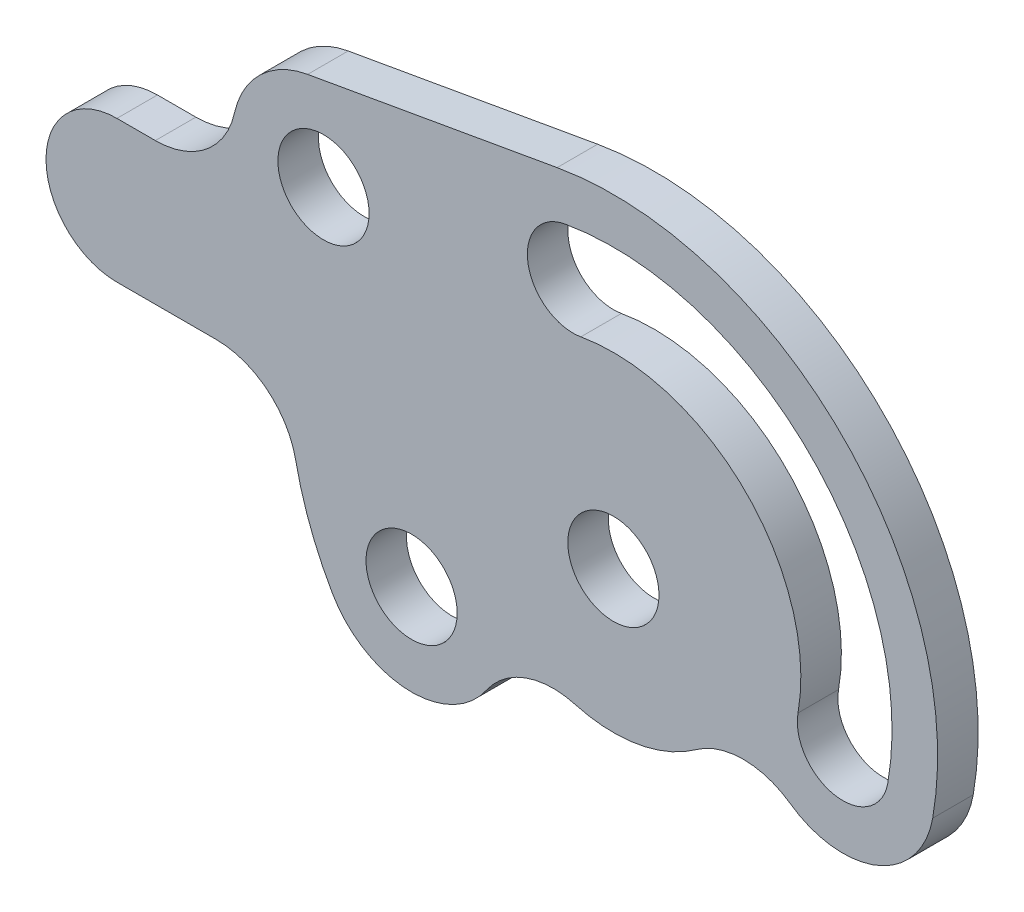
ISO-10303-21;
HEADER;
FILE_DESCRIPTION(('STEP AP214'),'2;1');
FILE_NAME('part.step','',(''),(''),'','','');
FILE_SCHEMA(('AUTOMOTIVE_DESIGN { 1 0 10303 214 1 1 1 1 }'));
ENDSEC;
DATA;
#1=APPLICATION_CONTEXT('core data for automotive mechanical design processes');
#2=APPLICATION_PROTOCOL_DEFINITION('international standard','automotive_design',2000,#1);
#3=PRODUCT_CONTEXT('',#1,'mechanical');
#4=PRODUCT('Part','Part','',(#3));
#5=PRODUCT_RELATED_PRODUCT_CATEGORY('part','',(#4));
#6=PRODUCT_DEFINITION_FORMATION('','',#4);
#7=PRODUCT_DEFINITION_CONTEXT('part definition',#1,'design');
#8=PRODUCT_DEFINITION('design','',#6,#7);
#9=PRODUCT_DEFINITION_SHAPE('','',#8);
#10=(LENGTH_UNIT() NAMED_UNIT(*) SI_UNIT(.MILLI.,.METRE.));
#11=(NAMED_UNIT(*) PLANE_ANGLE_UNIT() SI_UNIT($,.RADIAN.));
#12=(NAMED_UNIT(*) SI_UNIT($,.STERADIAN.) SOLID_ANGLE_UNIT());
#13=UNCERTAINTY_MEASURE_WITH_UNIT(LENGTH_MEASURE(1.E-05),#10,'distance_accuracy_value','');
#14=(GEOMETRIC_REPRESENTATION_CONTEXT(3) GLOBAL_UNCERTAINTY_ASSIGNED_CONTEXT((#13)) GLOBAL_UNIT_ASSIGNED_CONTEXT((#10,
#11,#12)) REPRESENTATION_CONTEXT('',''));
#15=CARTESIAN_POINT('',(0.,0.,0.));
#16=DIRECTION('',(0.,0.,1.));
#17=DIRECTION('',(1.,0.,0.));
#18=AXIS2_PLACEMENT_3D('',#15,#16,#17);
#19=CARTESIAN_POINT('',(8.98944827046456,-1.58508227176595,1.5875));
#20=DIRECTION('',(0.,0.,-1.));
#21=DIRECTION('',(-1.,0.,0.));
#22=AXIS2_PLACEMENT_3D('',#19,#20,#21);
#23=CYLINDRICAL_SURFACE('',#22,1.7859375);
#24=CARTESIAN_POINT('',(8.98944827046456,-1.58508227176595,0.));
#25=DIRECTION('',(0.,0.,1.));
#26=DIRECTION('',(1.,0.,0.));
#27=AXIS2_PLACEMENT_3D('',#24,#25,#26);
#28=CIRCLE('',#27,1.7859375);
#29=CARTESIAN_POINT('',(7.23064317406932,-1.27495747946392,0.));
#30=VERTEX_POINT('',#29);
#31=CARTESIAN_POINT('',(10.7482533668598,-1.89520706406799,0.));
#32=VERTEX_POINT('',#31);
#33=EDGE_CURVE('E288',#30,#32,#28,.T.);
#34=ORIENTED_EDGE('',*,*,#33,.F.);
#35=DIRECTION('',(0.,0.,-1.));
#36=VECTOR('',#35,1.);
#37=CARTESIAN_POINT('',(7.23064317406932,-1.27495747946392,1.5875));
#38=LINE('',#37,#36);
#39=CARTESIAN_POINT('',(7.23064317406932,-1.27495747946392,1.5875));
#40=VERTEX_POINT('',#39);
#41=EDGE_CURVE('E324',#40,#30,#38,.T.);
#42=ORIENTED_EDGE('',*,*,#41,.F.);
#43=CARTESIAN_POINT('',(8.98944827046456,-1.58508227176595,1.5875));
#44=DIRECTION('',(0.,0.,1.));
#45=DIRECTION('',(1.,0.,0.));
#46=AXIS2_PLACEMENT_3D('',#43,#44,#45);
#47=CIRCLE('',#46,1.7859375);
#48=CARTESIAN_POINT('',(10.7482533668598,-1.89520706406799,1.5875));
#49=VERTEX_POINT('',#48);
#50=EDGE_CURVE('E226',#40,#49,#47,.T.);
#51=ORIENTED_EDGE('',*,*,#50,.T.);
#52=DIRECTION('',(0.,0.,-1.));
#53=VECTOR('',#52,1.);
#54=CARTESIAN_POINT('',(10.7482533668598,-1.89520706406799,1.5875));
#55=LINE('',#54,#53);
#56=EDGE_CURVE('E193',#49,#32,#55,.T.);
#57=ORIENTED_EDGE('',*,*,#56,.T.);
#58=EDGE_LOOP('',(#34,#42,#51,#57));
#59=FACE_BOUND('',#58,.T.);
#60=ADVANCED_FACE('F41',(#59),#23,.F.);
#61=CARTESIAN_POINT('',(0.,0.,1.5875));
#62=DIRECTION('',(0.,0.,-1.));
#63=DIRECTION('',(-1.,0.,0.));
#64=AXIS2_PLACEMENT_3D('',#61,#62,#63);
#65=CYLINDRICAL_SURFACE('',#64,7.3421875);
#66=CARTESIAN_POINT('',(0.,0.,0.));
#67=DIRECTION('',(0.,0.,1.));
#68=DIRECTION('',(1.,0.,0.));
#69=AXIS2_PLACEMENT_3D('',#66,#67,#68);
#70=CIRCLE('',#69,7.3421875);
#71=CARTESIAN_POINT('',(-1.27495747946392,7.23064317406932,0.));
#72=VERTEX_POINT('',#71);
#73=EDGE_CURVE('E292',#30,#72,#70,.T.);
#74=ORIENTED_EDGE('',*,*,#73,.T.);
#75=DIRECTION('',(0.,0.,-1.));
#76=VECTOR('',#75,1.);
#77=CARTESIAN_POINT('',(-1.27495747946392,7.23064317406932,1.5875));
#78=LINE('',#77,#76);
#79=CARTESIAN_POINT('',(-1.27495747946392,7.23064317406932,1.5875));
#80=VERTEX_POINT('',#79);
#81=EDGE_CURVE('E321',#80,#72,#78,.T.);
#82=ORIENTED_EDGE('',*,*,#81,.F.);
#83=CARTESIAN_POINT('',(0.,0.,1.5875));
#84=DIRECTION('',(0.,0.,1.));
#85=DIRECTION('',(1.,0.,0.));
#86=AXIS2_PLACEMENT_3D('',#83,#84,#85);
#87=CIRCLE('',#86,7.3421875);
#88=EDGE_CURVE('E230',#40,#80,#87,.T.);
#89=ORIENTED_EDGE('',*,*,#88,.F.);
#90=ORIENTED_EDGE('',*,*,#41,.T.);
#91=EDGE_LOOP('',(#74,#82,#89,#90));
#92=FACE_BOUND('',#91,.T.);
#93=ADVANCED_FACE('F437',(#92),#65,.T.);
#94=CARTESIAN_POINT('',(-1.58508227176596,8.98944827046456,1.5875));
#95=DIRECTION('',(0.,0.,-1.));
#96=DIRECTION('',(-1.,0.,0.));
#97=AXIS2_PLACEMENT_3D('',#94,#95,#96);
#98=CYLINDRICAL_SURFACE('',#97,1.7859375);
#99=CARTESIAN_POINT('',(-1.58508227176596,8.98944827046456,0.));
#100=DIRECTION('',(0.,0.,1.));
#101=DIRECTION('',(1.,0.,0.));
#102=AXIS2_PLACEMENT_3D('',#99,#100,#101);
#103=CIRCLE('',#102,1.7859375);
#104=CARTESIAN_POINT('',(-1.89520706406799,10.7482533668598,0.));
#105=VERTEX_POINT('',#104);
#106=EDGE_CURVE('E296',#105,#72,#103,.T.);
#107=ORIENTED_EDGE('',*,*,#106,.F.);
#108=DIRECTION('',(0.,0.,-1.));
#109=VECTOR('',#108,1.);
#110=CARTESIAN_POINT('',(-1.89520706406799,10.7482533668598,1.5875));
#111=LINE('',#110,#109);
#112=CARTESIAN_POINT('',(-1.89520706406799,10.7482533668598,1.5875));
#113=VERTEX_POINT('',#112);
#114=EDGE_CURVE('E318',#113,#105,#111,.T.);
#115=ORIENTED_EDGE('',*,*,#114,.F.);
#116=CARTESIAN_POINT('',(-1.58508227176596,8.98944827046456,1.5875));
#117=DIRECTION('',(0.,0.,1.));
#118=DIRECTION('',(1.,0.,0.));
#119=AXIS2_PLACEMENT_3D('',#116,#117,#118);
#120=CIRCLE('',#119,1.7859375);
#121=EDGE_CURVE('E233',#113,#80,#120,.T.);
#122=ORIENTED_EDGE('',*,*,#121,.T.);
#123=ORIENTED_EDGE('',*,*,#81,.T.);
#124=EDGE_LOOP('',(#107,#115,#122,#123));
#125=FACE_BOUND('',#124,.T.);
#126=ADVANCED_FACE('F443',(#125),#98,.F.);
#127=CARTESIAN_POINT('',(0.,0.,1.5875));
#128=DIRECTION('',(0.,0.,-1.));
#129=DIRECTION('',(-1.,0.,0.));
#130=AXIS2_PLACEMENT_3D('',#127,#128,#129);
#131=CYLINDRICAL_SURFACE('',#130,5.55625);
#132=CARTESIAN_POINT('',(0.,0.,0.));
#133=DIRECTION('',(0.,0.,1.));
#134=DIRECTION('',(1.,0.,0.));
#135=AXIS2_PLACEMENT_3D('',#132,#133,#134);
#136=CIRCLE('',#135,5.55625);
#137=CARTESIAN_POINT('',(-1.50139711339282,-5.34955332438099,0.));
#138=VERTEX_POINT('',#137);
#139=CARTESIAN_POINT('',(3.2405067830576,-4.51342772751018,0.));
#140=VERTEX_POINT('',#139);
#141=EDGE_CURVE('E254',#138,#140,#136,.T.);
#142=ORIENTED_EDGE('',*,*,#141,.T.);
#143=DIRECTION('',(0.,0.,-1.));
#144=VECTOR('',#143,1.);
#145=CARTESIAN_POINT('',(3.2405067830576,-4.51342772751018,1.5875));
#146=LINE('',#145,#144);
#147=CARTESIAN_POINT('',(3.2405067830576,-4.51342772751018,1.5875));
#148=VERTEX_POINT('',#147);
#149=EDGE_CURVE('E348',#140,#148,#146,.F.);
#150=ORIENTED_EDGE('',*,*,#149,.T.);
#151=CARTESIAN_POINT('',(0.,0.,1.5875));
#152=DIRECTION('',(0.,0.,1.));
#153=DIRECTION('',(1.,0.,0.));
#154=AXIS2_PLACEMENT_3D('',#151,#152,#153);
#155=CIRCLE('',#154,5.55625);
#156=CARTESIAN_POINT('',(-1.50139711339282,-5.34955332438099,1.5875));
#157=VERTEX_POINT('',#156);
#158=EDGE_CURVE('E182',#157,#148,#155,.T.);
#159=ORIENTED_EDGE('',*,*,#158,.F.);
#160=DIRECTION('',(0.,0.,-1.));
#161=VECTOR('',#160,1.);
#162=CARTESIAN_POINT('',(-1.50139711339282,-5.34955332438099,1.5875));
#163=LINE('',#162,#161);
#164=EDGE_CURVE('E344',#157,#138,#163,.T.);
#165=ORIENTED_EDGE('',*,*,#164,.T.);
#166=EDGE_LOOP('',(#142,#150,#159,#165));
#167=FACE_BOUND('',#166,.T.);
#168=ADVANCED_FACE('F421',(#167),#131,.T.);
#169=CARTESIAN_POINT('',(8.98944827046456,-1.58508227176595,1.5875));
#170=DIRECTION('',(0.,0.,-1.));
#171=DIRECTION('',(-1.,0.,0.));
#172=AXIS2_PLACEMENT_3D('',#169,#170,#171);
#173=CYLINDRICAL_SURFACE('',#172,3.571875);
#174=CARTESIAN_POINT('',(8.98944827046456,-1.58508227176595,1.5875));
#175=DIRECTION('',(0.,0.,1.));
#176=DIRECTION('',(1.,0.,0.));
#177=AXIS2_PLACEMENT_3D('',#174,#175,#176);
#178=CIRCLE('',#177,3.571875);
#179=CARTESIAN_POINT('',(6.9262123921741,-4.50078951464203,1.5875));
#180=VERTEX_POINT('',#179);
#181=CARTESIAN_POINT('',(12.507058463255,-2.20533185637002,1.5875));
#182=VERTEX_POINT('',#181);
#183=EDGE_CURVE('E166',#180,#182,#178,.T.);
#184=ORIENTED_EDGE('',*,*,#183,.F.);
#185=DIRECTION('',(0.,0.,-1.));
#186=VECTOR('',#185,1.);
#187=CARTESIAN_POINT('',(6.9262123921741,-4.50078951464203,1.5875));
#188=LINE('',#187,#186);
#189=CARTESIAN_POINT('',(6.9262123921741,-4.50078951464203,0.));
#190=VERTEX_POINT('',#189);
#191=EDGE_CURVE('E327',#180,#190,#188,.T.);
#192=ORIENTED_EDGE('',*,*,#191,.T.);
#193=CARTESIAN_POINT('',(8.98944827046456,-1.58508227176595,0.));
#194=DIRECTION('',(0.,0.,1.));
#195=DIRECTION('',(1.,0.,0.));
#196=AXIS2_PLACEMENT_3D('',#193,#194,#195);
#197=CIRCLE('',#196,3.571875);
#198=CARTESIAN_POINT('',(12.507058463255,-2.20533185637002,0.));
#199=VERTEX_POINT('',#198);
#200=EDGE_CURVE('E188',#190,#199,#197,.T.);
#201=ORIENTED_EDGE('',*,*,#200,.T.);
#202=DIRECTION('',(0.,0.,-1.));
#203=VECTOR('',#202,1.);
#204=CARTESIAN_POINT('',(12.507058463255,-2.20533185637002,1.5875));
#205=LINE('',#204,#203);
#206=EDGE_CURVE('E185',#182,#199,#205,.T.);
#207=ORIENTED_EDGE('',*,*,#206,.F.);
#208=EDGE_LOOP('',(#184,#192,#201,#207));
#209=FACE_BOUND('',#208,.T.);
#210=ADVANCED_FACE('F186',(#209),#173,.T.);
#211=CARTESIAN_POINT('',(0.,0.,1.5875));
#212=DIRECTION('',(0.,0.,-1.));
#213=DIRECTION('',(-1.,0.,0.));
#214=AXIS2_PLACEMENT_3D('',#211,#212,#213);
#215=CYLINDRICAL_SURFACE('',#214,12.7);
#216=CARTESIAN_POINT('',(0.,0.,0.));
#217=DIRECTION('',(0.,0.,1.));
#218=DIRECTION('',(1.,0.,0.));
#219=AXIS2_PLACEMENT_3D('',#216,#217,#218);
#220=CIRCLE('',#219,12.7);
#221=CARTESIAN_POINT('',(-2.20533185637003,12.507058463255,0.));
#222=VERTEX_POINT('',#221);
#223=EDGE_CURVE('E260',#199,#222,#220,.T.);
#224=ORIENTED_EDGE('',*,*,#223,.T.);
#225=DIRECTION('',(0.,0.,-1.));
#226=VECTOR('',#225,1.);
#227=CARTESIAN_POINT('',(-2.20533185637003,12.507058463255,1.5875));
#228=LINE('',#227,#226);
#229=CARTESIAN_POINT('',(-2.20533185637003,12.507058463255,1.5875));
#230=VERTEX_POINT('',#229);
#231=EDGE_CURVE('E194',#230,#222,#228,.T.);
#232=ORIENTED_EDGE('',*,*,#231,.F.);
#233=CARTESIAN_POINT('',(0.,0.,1.5875));
#234=DIRECTION('',(0.,0.,1.));
#235=DIRECTION('',(1.,0.,0.));
#236=AXIS2_PLACEMENT_3D('',#233,#234,#235);
#237=CIRCLE('',#236,12.7);
#238=EDGE_CURVE('E173',#182,#230,#237,.T.);
#239=ORIENTED_EDGE('',*,*,#238,.F.);
#240=ORIENTED_EDGE('',*,*,#206,.T.);
#241=EDGE_LOOP('',(#224,#232,#239,#240));
#242=FACE_BOUND('',#241,.T.);
#243=ADVANCED_FACE('F196',(#242),#215,.T.);
#244=CARTESIAN_POINT('',(-2.20533185637003,12.507058463255,1.5875));
#245=DIRECTION('',(-0.173648177666931,0.984807753012208,0.));
#246=DIRECTION('',(-0.984807753012208,-0.173648177666931,0.));
#247=AXIS2_PLACEMENT_3D('',#244,#245,#246);
#248=PLANE('',#247);
#249=DIRECTION('',(0.984807753012208,0.173648177666931,0.));
#250=VECTOR('',#249,1.);
#251=CARTESIAN_POINT('',(-2.20533185637003,12.507058463255,0.));
#252=LINE('',#251,#250);
#253=CARTESIAN_POINT('',(-11.976471280788,10.784142950466,0.));
#254=VERTEX_POINT('',#253);
#255=EDGE_CURVE('E263',#254,#222,#252,.T.);
#256=ORIENTED_EDGE('',*,*,#255,.F.);
#257=DIRECTION('',(0.,0.,-1.));
#258=VECTOR('',#257,1.);
#259=CARTESIAN_POINT('',(-11.976471280788,10.784142950466,1.5875));
#260=LINE('',#259,#258);
#261=CARTESIAN_POINT('',(-11.976471280788,10.784142950466,1.5875));
#262=VERTEX_POINT('',#261);
#263=EDGE_CURVE('E337',#262,#254,#260,.T.);
#264=ORIENTED_EDGE('',*,*,#263,.F.);
#265=DIRECTION('',(0.984807753012208,0.173648177666931,0.));
#266=VECTOR('',#265,1.);
#267=CARTESIAN_POINT('',(-2.20533185637003,12.507058463255,1.5875));
#268=LINE('',#267,#266);
#269=EDGE_CURVE('E199',#262,#230,#268,.T.);
#270=ORIENTED_EDGE('',*,*,#269,.T.);
#271=ORIENTED_EDGE('',*,*,#231,.T.);
#272=EDGE_LOOP('',(#256,#264,#270,#271));
#273=FACE_BOUND('',#272,.T.);
#274=ADVANCED_FACE('F417',(#273),#248,.T.);
#275=CARTESIAN_POINT('',(-11.356221696184,7.26653275767548,1.5875));
#276=DIRECTION('',(0.,0.,-1.));
#277=DIRECTION('',(-1.,0.,0.));
#278=AXIS2_PLACEMENT_3D('',#275,#276,#277);
#279=CYLINDRICAL_SURFACE('',#278,3.571875);
#280=CARTESIAN_POINT('',(-11.356221696184,7.26653275767548,0.));
#281=DIRECTION('',(0.,0.,1.));
#282=DIRECTION('',(1.,0.,0.));
#283=AXIS2_PLACEMENT_3D('',#280,#281,#282);
#284=CIRCLE('',#283,3.571875);
#285=CARTESIAN_POINT('',(-14.8429086747101,8.04197129772964,0.));
#286=VERTEX_POINT('',#285);
#287=EDGE_CURVE('E267',#254,#286,#284,.T.);
#288=ORIENTED_EDGE('',*,*,#287,.T.);
#289=DIRECTION('',(0.,0.,-1.));
#290=VECTOR('',#289,1.);
#291=CARTESIAN_POINT('',(-14.8429086747101,8.04197129772964,1.5875));
#292=LINE('',#291,#290);
#293=CARTESIAN_POINT('',(-14.8429086747101,8.04197129772964,1.5875));
#294=VERTEX_POINT('',#293);
#295=EDGE_CURVE('E57',#286,#294,#292,.F.);
#296=ORIENTED_EDGE('',*,*,#295,.T.);
#297=CARTESIAN_POINT('',(-11.356221696184,7.26653275767548,1.5875));
#298=DIRECTION('',(0.,0.,1.));
#299=DIRECTION('',(1.,0.,0.));
#300=AXIS2_PLACEMENT_3D('',#297,#298,#299);
#301=CIRCLE('',#300,3.571875);
#302=EDGE_CURVE('E202',#262,#294,#301,.T.);
#303=ORIENTED_EDGE('',*,*,#302,.F.);
#304=ORIENTED_EDGE('',*,*,#263,.T.);
#305=EDGE_LOOP('',(#288,#296,#303,#304));
#306=FACE_BOUND('',#305,.T.);
#307=ADVANCED_FACE('F414',(#306),#279,.T.);
#308=CARTESIAN_POINT('',(0.,5.55625,1.5875));
#309=DIRECTION('',(0.,1.,0.));
#310=DIRECTION('',(-1.,0.,0.));
#311=AXIS2_PLACEMENT_3D('',#308,#309,#310);
#312=PLANE('',#311);
#313=DIRECTION('',(1.,0.,0.));
#314=VECTOR('',#313,1.);
#315=CARTESIAN_POINT('',(0.,5.55625,1.5875));
#316=LINE('',#315,#314);
#317=CARTESIAN_POINT('',(-19.446875,5.55625,1.5875));
#318=VERTEX_POINT('',#317);
#319=CARTESIAN_POINT('',(-17.9421859889555,5.55625,1.5875));
#320=VERTEX_POINT('',#319);
#321=EDGE_CURVE('E208',#318,#320,#316,.T.);
#322=ORIENTED_EDGE('',*,*,#321,.T.);
#323=DIRECTION('',(0.,0.,-1.));
#324=VECTOR('',#323,1.);
#325=CARTESIAN_POINT('',(-17.9421859889555,5.55625,1.5875));
#326=LINE('',#325,#324);
#327=CARTESIAN_POINT('',(-17.9421859889555,5.55625,0.));
#328=VERTEX_POINT('',#327);
#329=EDGE_CURVE('E361',#320,#328,#326,.T.);
#330=ORIENTED_EDGE('',*,*,#329,.T.);
#331=DIRECTION('',(1.,0.,0.));
#332=VECTOR('',#331,1.);
#333=CARTESIAN_POINT('',(0.,5.55625,0.));
#334=LINE('',#333,#332);
#335=CARTESIAN_POINT('',(-19.446875,5.55625,0.));
#336=VERTEX_POINT('',#335);
#337=EDGE_CURVE('E270',#336,#328,#334,.T.);
#338=ORIENTED_EDGE('',*,*,#337,.F.);
#339=DIRECTION('',(0.,0.,-1.));
#340=VECTOR('',#339,1.);
#341=CARTESIAN_POINT('',(-19.446875,5.55625,1.5875));
#342=LINE('',#341,#340);
#343=EDGE_CURVE('E334',#318,#336,#342,.T.);
#344=ORIENTED_EDGE('',*,*,#343,.F.);
#345=EDGE_LOOP('',(#322,#330,#338,#344));
#346=FACE_BOUND('',#345,.T.);
#347=ADVANCED_FACE('F410',(#346),#312,.T.);
#348=CARTESIAN_POINT('',(-19.446875,2.778125,1.5875));
#349=DIRECTION('',(0.,0.,-1.));
#350=DIRECTION('',(-1.,0.,0.));
#351=AXIS2_PLACEMENT_3D('',#348,#349,#350);
#352=CYLINDRICAL_SURFACE('',#351,2.778125);
#353=CARTESIAN_POINT('',(-19.446875,2.778125,0.));
#354=DIRECTION('',(0.,0.,1.));
#355=DIRECTION('',(1.,0.,0.));
#356=AXIS2_PLACEMENT_3D('',#353,#354,#355);
#357=CIRCLE('',#356,2.778125);
#358=CARTESIAN_POINT('',(-19.446875,0.,0.));
#359=VERTEX_POINT('',#358);
#360=EDGE_CURVE('E273',#336,#359,#357,.T.);
#361=ORIENTED_EDGE('',*,*,#360,.T.);
#362=DIRECTION('',(0.,0.,-1.));
#363=VECTOR('',#362,1.);
#364=CARTESIAN_POINT('',(-19.446875,0.,1.5875));
#365=LINE('',#364,#363);
#366=CARTESIAN_POINT('',(-19.446875,0.,1.5875));
#367=VERTEX_POINT('',#366);
#368=EDGE_CURVE('E330',#367,#359,#365,.T.);
#369=ORIENTED_EDGE('',*,*,#368,.F.);
#370=CARTESIAN_POINT('',(-19.446875,2.778125,1.5875));
#371=DIRECTION('',(0.,0.,1.));
#372=DIRECTION('',(1.,0.,0.));
#373=AXIS2_PLACEMENT_3D('',#370,#371,#372);
#374=CIRCLE('',#373,2.778125);
#375=EDGE_CURVE('E212',#318,#367,#374,.T.);
#376=ORIENTED_EDGE('',*,*,#375,.F.);
#377=ORIENTED_EDGE('',*,*,#343,.T.);
#378=EDGE_LOOP('',(#361,#369,#376,#377));
#379=FACE_BOUND('',#378,.T.);
#380=ADVANCED_FACE('F406',(#379),#352,.T.);
#381=CARTESIAN_POINT('',(0.,0.,1.5875));
#382=DIRECTION('',(0.,1.,0.));
#383=DIRECTION('',(-1.,0.,0.));
#384=AXIS2_PLACEMENT_3D('',#381,#382,#383);
#385=PLANE('',#384);
#386=DIRECTION('',(1.,0.,0.));
#387=VECTOR('',#386,1.);
#388=CARTESIAN_POINT('',(0.,0.,0.));
#389=LINE('',#388,#387);
#390=CARTESIAN_POINT('',(-15.5542598666732,0.,0.));
#391=VERTEX_POINT('',#390);
#392=EDGE_CURVE('E276',#359,#391,#389,.T.);
#393=ORIENTED_EDGE('',*,*,#392,.T.);
#394=DIRECTION('',(0.,0.,-1.));
#395=VECTOR('',#394,1.);
#396=CARTESIAN_POINT('',(-15.5542598666732,0.,1.5875));
#397=LINE('',#396,#395);
#398=CARTESIAN_POINT('',(-15.5542598666732,0.,1.5875));
#399=VERTEX_POINT('',#398);
#400=EDGE_CURVE('E358',#391,#399,#397,.F.);
#401=ORIENTED_EDGE('',*,*,#400,.T.);
#402=DIRECTION('',(1.,0.,0.));
#403=VECTOR('',#402,1.);
#404=CARTESIAN_POINT('',(0.,0.,1.5875));
#405=LINE('',#404,#403);
#406=EDGE_CURVE('E215',#367,#399,#405,.T.);
#407=ORIENTED_EDGE('',*,*,#406,.F.);
#408=ORIENTED_EDGE('',*,*,#368,.T.);
#409=EDGE_LOOP('',(#393,#401,#407,#408));
#410=FACE_BOUND('',#409,.T.);
#411=ADVANCED_FACE('F402',(#410),#385,.F.);
#412=CARTESIAN_POINT('',(0.,0.,1.5875));
#413=DIRECTION('',(0.,0.,-1.));
#414=DIRECTION('',(-1.,0.,0.));
#415=AXIS2_PLACEMENT_3D('',#412,#413,#414);
#416=CYLINDRICAL_SURFACE('',#415,12.7);
#417=CARTESIAN_POINT('',(0.,0.,1.5875));
#418=DIRECTION('',(0.,0.,1.));
#419=DIRECTION('',(1.,0.,0.));
#420=AXIS2_PLACEMENT_3D('',#417,#418,#419);
#421=CIRCLE('',#420,12.7);
#422=CARTESIAN_POINT('',(-10.9985226280624,-6.35000000000002,1.5875));
#423=VERTEX_POINT('',#422);
#424=CARTESIAN_POINT('',(-12.4434078933385,-2.54,1.5875));
#425=VERTEX_POINT('',#424);
#426=EDGE_CURVE('E219',#423,#425,#421,.F.);
#427=ORIENTED_EDGE('',*,*,#426,.T.);
#428=DIRECTION('',(0.,0.,-1.));
#429=VECTOR('',#428,1.);
#430=CARTESIAN_POINT('',(-12.4434078933385,-2.54,1.5875));
#431=LINE('',#430,#429);
#432=CARTESIAN_POINT('',(-12.4434078933385,-2.54,0.));
#433=VERTEX_POINT('',#432);
#434=EDGE_CURVE('E354',#425,#433,#431,.T.);
#435=ORIENTED_EDGE('',*,*,#434,.T.);
#436=CARTESIAN_POINT('',(0.,0.,0.));
#437=DIRECTION('',(0.,0.,1.));
#438=DIRECTION('',(1.,0.,0.));
#439=AXIS2_PLACEMENT_3D('',#436,#437,#438);
#440=CIRCLE('',#439,12.7);
#441=CARTESIAN_POINT('',(-10.9985226280624,-6.35000000000002,0.));
#442=VERTEX_POINT('',#441);
#443=EDGE_CURVE('E280',#442,#433,#440,.F.);
#444=ORIENTED_EDGE('',*,*,#443,.F.);
#445=DIRECTION('',(0.,0.,-1.));
#446=VECTOR('',#445,1.);
#447=CARTESIAN_POINT('',(-10.9985226280624,-6.35000000000002,1.5875));
#448=LINE('',#447,#446);
#449=EDGE_CURVE('E253',#423,#442,#448,.T.);
#450=ORIENTED_EDGE('',*,*,#449,.F.);
#451=EDGE_LOOP('',(#427,#435,#444,#450));
#452=FACE_BOUND('',#451,.T.);
#453=ADVANCED_FACE('F391',(#452),#416,.T.);
#454=CARTESIAN_POINT('',(0.,0.,1.5875));
#455=DIRECTION('',(0.,0.,-1.));
#456=DIRECTION('',(-1.,0.,0.));
#457=AXIS2_PLACEMENT_3D('',#454,#455,#456);
#458=CYLINDRICAL_SURFACE('',#457,1.7859375);
#459=CARTESIAN_POINT('',(0.,0.,1.5875));
#460=DIRECTION('',(0.,0.,1.));
#461=DIRECTION('',(1.,0.,0.));
#462=AXIS2_PLACEMENT_3D('',#459,#460,#461);
#463=CIRCLE('',#462,1.7859375);
#464=CARTESIAN_POINT('',(1.7859375,0.,1.5875));
#465=VERTEX_POINT('',#464);
#466=EDGE_CURVE('E245',#465,#465,#463,.T.);
#467=ORIENTED_EDGE('',*,*,#466,.T.);
#468=EDGE_LOOP('',(#467));
#469=FACE_BOUND('',#468,.T.);
#470=CARTESIAN_POINT('',(0.,0.,0.));
#471=DIRECTION('',(0.,0.,1.));
#472=DIRECTION('',(1.,0.,0.));
#473=AXIS2_PLACEMENT_3D('',#470,#471,#472);
#474=CIRCLE('',#473,1.7859375);
#475=CARTESIAN_POINT('',(1.7859375,0.,0.));
#476=VERTEX_POINT('',#475);
#477=EDGE_CURVE('E308',#476,#476,#474,.T.);
#478=ORIENTED_EDGE('',*,*,#477,.F.);
#479=EDGE_LOOP('',(#478));
#480=FACE_BOUND('',#479,.T.);
#481=ADVANCED_FACE('F457',(#469,#480),#458,.F.);
#482=CARTESIAN_POINT('',(-11.356221696184,7.26653275767548,1.5875));
#483=DIRECTION('',(0.,0.,-1.));
#484=DIRECTION('',(-1.,0.,0.));
#485=AXIS2_PLACEMENT_3D('',#482,#483,#484);
#486=CYLINDRICAL_SURFACE('',#485,1.7859375);
#487=CARTESIAN_POINT('',(-11.356221696184,7.26653275767548,1.5875));
#488=DIRECTION('',(0.,0.,1.));
#489=DIRECTION('',(1.,0.,0.));
#490=AXIS2_PLACEMENT_3D('',#487,#488,#489);
#491=CIRCLE('',#490,1.7859375);
#492=CARTESIAN_POINT('',(-9.57028419618396,7.26653275767548,1.5875));
#493=VERTEX_POINT('',#492);
#494=EDGE_CURVE('E241',#493,#493,#491,.T.);
#495=ORIENTED_EDGE('',*,*,#494,.T.);
#496=EDGE_LOOP('',(#495));
#497=FACE_BOUND('',#496,.T.);
#498=CARTESIAN_POINT('',(-11.356221696184,7.26653275767548,0.));
#499=DIRECTION('',(0.,0.,1.));
#500=DIRECTION('',(1.,0.,0.));
#501=AXIS2_PLACEMENT_3D('',#498,#499,#500);
#502=CIRCLE('',#501,1.7859375);
#503=CARTESIAN_POINT('',(-9.57028419618396,7.26653275767548,0.));
#504=VERTEX_POINT('',#503);
#505=EDGE_CURVE('E304',#504,#504,#502,.T.);
#506=ORIENTED_EDGE('',*,*,#505,.F.);
#507=EDGE_LOOP('',(#506));
#508=FACE_BOUND('',#507,.T.);
#509=ADVANCED_FACE('F482',(#497,#508),#486,.F.);
#510=CARTESIAN_POINT('',(0.,0.,1.5875));
#511=DIRECTION('',(0.,0.,-1.));
#512=DIRECTION('',(-1.,0.,0.));
#513=AXIS2_PLACEMENT_3D('',#510,#511,#512);
#514=CYLINDRICAL_SURFACE('',#513,10.9140625);
#515=CARTESIAN_POINT('',(0.,0.,0.));
#516=DIRECTION('',(0.,0.,1.));
#517=DIRECTION('',(1.,0.,0.));
#518=AXIS2_PLACEMENT_3D('',#515,#516,#517);
#519=CIRCLE('',#518,10.9140625);
#520=EDGE_CURVE('E300',#32,#105,#519,.T.);
#521=ORIENTED_EDGE('',*,*,#520,.F.);
#522=ORIENTED_EDGE('',*,*,#56,.F.);
#523=CARTESIAN_POINT('',(0.,0.,1.5875));
#524=DIRECTION('',(0.,0.,1.));
#525=DIRECTION('',(1.,0.,0.));
#526=AXIS2_PLACEMENT_3D('',#523,#524,#525);
#527=CIRCLE('',#526,10.9140625);
#528=EDGE_CURVE('E237',#49,#113,#527,.T.);
#529=ORIENTED_EDGE('',*,*,#528,.T.);
#530=ORIENTED_EDGE('',*,*,#114,.T.);
#531=EDGE_LOOP('',(#521,#522,#529,#530));
#532=FACE_BOUND('',#531,.T.);
#533=ADVANCED_FACE('F453',(#532),#514,.F.);
#534=CARTESIAN_POINT('',(-7.90518813891982,-4.56406250000001,1.5875));
#535=DIRECTION('',(0.,0.,-1.));
#536=DIRECTION('',(-1.,0.,0.));
#537=AXIS2_PLACEMENT_3D('',#534,#535,#536);
#538=CYLINDRICAL_SURFACE('',#537,3.571875);
#539=CARTESIAN_POINT('',(-7.90518813891982,-4.56406250000001,0.));
#540=DIRECTION('',(0.,0.,1.));
#541=DIRECTION('',(1.,0.,0.));
#542=AXIS2_PLACEMENT_3D('',#539,#540,#541);
#543=CIRCLE('',#542,3.571875);
#544=CARTESIAN_POINT('',(-4.96915000004538,-6.59826284969512,0.));
#545=VERTEX_POINT('',#544);
#546=EDGE_CURVE('E284',#442,#545,#543,.T.);
#547=ORIENTED_EDGE('',*,*,#546,.T.);
#548=DIRECTION('',(0.,0.,-1.));
#549=VECTOR('',#548,1.);
#550=CARTESIAN_POINT('',(-4.96915000004538,-6.59826284969512,1.5875));
#551=LINE('',#550,#549);
#552=CARTESIAN_POINT('',(-4.96915000004538,-6.59826284969512,1.5875));
#553=VERTEX_POINT('',#552);
#554=EDGE_CURVE('E351',#545,#553,#551,.F.);
#555=ORIENTED_EDGE('',*,*,#554,.T.);
#556=CARTESIAN_POINT('',(-7.90518813891982,-4.56406250000001,1.5875));
#557=DIRECTION('',(0.,0.,1.));
#558=DIRECTION('',(1.,0.,0.));
#559=AXIS2_PLACEMENT_3D('',#556,#557,#558);
#560=CIRCLE('',#559,3.571875);
#561=EDGE_CURVE('E223',#423,#553,#560,.T.);
#562=ORIENTED_EDGE('',*,*,#561,.F.);
#563=ORIENTED_EDGE('',*,*,#449,.T.);
#564=EDGE_LOOP('',(#547,#555,#562,#563));
#565=FACE_BOUND('',#564,.T.);
#566=ADVANCED_FACE('F449',(#565),#538,.T.);
#567=CARTESIAN_POINT('',(-7.90518813891982,-4.56406250000001,1.5875));
#568=DIRECTION('',(0.,0.,-1.));
#569=DIRECTION('',(-1.,0.,0.));
#570=AXIS2_PLACEMENT_3D('',#567,#568,#569);
#571=CYLINDRICAL_SURFACE('',#570,1.7859375);
#572=CARTESIAN_POINT('',(-7.90518813891982,-4.56406250000001,1.5875));
#573=DIRECTION('',(0.,0.,1.));
#574=DIRECTION('',(1.,0.,0.));
#575=AXIS2_PLACEMENT_3D('',#572,#573,#574);
#576=CIRCLE('',#575,1.7859375);
#577=CARTESIAN_POINT('',(-6.11925063891982,-4.56406250000001,1.5875));
#578=VERTEX_POINT('',#577);
#579=EDGE_CURVE('E249',#578,#578,#576,.T.);
#580=ORIENTED_EDGE('',*,*,#579,.T.);
#581=EDGE_LOOP('',(#580));
#582=FACE_BOUND('',#581,.T.);
#583=CARTESIAN_POINT('',(-7.90518813891982,-4.56406250000001,0.));
#584=DIRECTION('',(0.,0.,1.));
#585=DIRECTION('',(1.,0.,0.));
#586=AXIS2_PLACEMENT_3D('',#583,#584,#585);
#587=CIRCLE('',#586,1.7859375);
#588=CARTESIAN_POINT('',(-6.11925063891982,-4.56406250000001,0.));
#589=VERTEX_POINT('',#588);
#590=EDGE_CURVE('E312',#589,#589,#587,.T.);
#591=ORIENTED_EDGE('',*,*,#590,.F.);
#592=EDGE_LOOP('',(#591));
#593=FACE_BOUND('',#592,.T.);
#594=ADVANCED_FACE('F452',(#582,#593),#571,.F.);
#595=CARTESIAN_POINT('',(0.,0.,1.5875));
#596=DIRECTION('',(0.,0.,1.));
#597=DIRECTION('',(1.,0.,0.));
#598=AXIS2_PLACEMENT_3D('',#595,#596,#597);
#599=PLANE('',#598);
#600=ORIENTED_EDGE('',*,*,#561,.T.);
#601=CARTESIAN_POINT('',(-2.35933832104587,-8.40644093831298,1.5875));
#602=DIRECTION('',(0.,0.,1.));
#603=DIRECTION('',(1.,0.,0.));
#604=AXIS2_PLACEMENT_3D('',#601,#602,#603);
#605=CIRCLE('',#604,3.175);
#606=EDGE_CURVE('E375',#553,#157,#605,.F.);
#607=ORIENTED_EDGE('',*,*,#606,.T.);
#608=ORIENTED_EDGE('',*,*,#158,.T.);
#609=CARTESIAN_POINT('',(5.0922249448048,-7.09252928608742,1.5875));
#610=DIRECTION('',(0.,0.,1.));
#611=DIRECTION('',(1.,0.,0.));
#612=AXIS2_PLACEMENT_3D('',#609,#610,#611);
#613=CIRCLE('',#612,3.175);
#614=EDGE_CURVE('E177',#148,#180,#613,.F.);
#615=ORIENTED_EDGE('',*,*,#614,.T.);
#616=ORIENTED_EDGE('',*,*,#183,.T.);
#617=ORIENTED_EDGE('',*,*,#238,.T.);
#618=ORIENTED_EDGE('',*,*,#269,.F.);
#619=ORIENTED_EDGE('',*,*,#302,.T.);
#620=CARTESIAN_POINT('',(-17.9421859889555,8.73125,1.5875));
#621=DIRECTION('',(0.,0.,1.));
#622=DIRECTION('',(1.,0.,0.));
#623=AXIS2_PLACEMENT_3D('',#620,#621,#622);
#624=CIRCLE('',#623,3.175);
#625=EDGE_CURVE('E11',#294,#320,#624,.F.);
#626=ORIENTED_EDGE('',*,*,#625,.T.);
#627=ORIENTED_EDGE('',*,*,#321,.F.);
#628=ORIENTED_EDGE('',*,*,#375,.T.);
#629=ORIENTED_EDGE('',*,*,#406,.T.);
#630=CARTESIAN_POINT('',(-15.5542598666732,-3.175,1.5875));
#631=DIRECTION('',(0.,0.,1.));
#632=DIRECTION('',(1.,0.,0.));
#633=AXIS2_PLACEMENT_3D('',#630,#631,#632);
#634=CIRCLE('',#633,3.175);
#635=EDGE_CURVE('E381',#399,#425,#634,.F.);
#636=ORIENTED_EDGE('',*,*,#635,.T.);
#637=ORIENTED_EDGE('',*,*,#426,.F.);
#638=EDGE_LOOP('',(#600,#607,#608,#615,#616,#617,#618,#619,#626,#627,#628,#629,#636,#637));
#639=FACE_BOUND('',#638,.T.);
#640=ORIENTED_EDGE('',*,*,#50,.F.);
#641=ORIENTED_EDGE('',*,*,#88,.T.);
#642=ORIENTED_EDGE('',*,*,#121,.F.);
#643=ORIENTED_EDGE('',*,*,#528,.F.);
#644=EDGE_LOOP('',(#640,#641,#642,#643));
#645=FACE_BOUND('',#644,.T.);
#646=ORIENTED_EDGE('',*,*,#494,.F.);
#647=EDGE_LOOP('',(#646));
#648=FACE_BOUND('',#647,.T.);
#649=ORIENTED_EDGE('',*,*,#466,.F.);
#650=EDGE_LOOP('',(#649));
#651=FACE_BOUND('',#650,.T.);
#652=ORIENTED_EDGE('',*,*,#579,.F.);
#653=EDGE_LOOP('',(#652));
#654=FACE_BOUND('',#653,.T.);
#655=ADVANCED_FACE('F169',(#639,#645,#648,#651,#654),#599,.T.);
#656=CARTESIAN_POINT('',(0.,0.,0.));
#657=DIRECTION('',(0.,0.,1.));
#658=DIRECTION('',(1.,0.,0.));
#659=AXIS2_PLACEMENT_3D('',#656,#657,#658);
#660=PLANE('',#659);
#661=ORIENTED_EDGE('',*,*,#141,.F.);
#662=CARTESIAN_POINT('',(-2.35933832104587,-8.40644093831298,0.));
#663=DIRECTION('',(0.,0.,1.));
#664=DIRECTION('',(1.,0.,0.));
#665=AXIS2_PLACEMENT_3D('',#662,#663,#664);
#666=CIRCLE('',#665,3.175);
#667=EDGE_CURVE('E372',#138,#545,#666,.T.);
#668=ORIENTED_EDGE('',*,*,#667,.T.);
#669=ORIENTED_EDGE('',*,*,#546,.F.);
#670=ORIENTED_EDGE('',*,*,#443,.T.);
#671=CARTESIAN_POINT('',(-15.5542598666732,-3.175,0.));
#672=DIRECTION('',(0.,0.,1.));
#673=DIRECTION('',(1.,0.,0.));
#674=AXIS2_PLACEMENT_3D('',#671,#672,#673);
#675=CIRCLE('',#674,3.175);
#676=EDGE_CURVE('E378',#433,#391,#675,.T.);
#677=ORIENTED_EDGE('',*,*,#676,.T.);
#678=ORIENTED_EDGE('',*,*,#392,.F.);
#679=ORIENTED_EDGE('',*,*,#360,.F.);
#680=ORIENTED_EDGE('',*,*,#337,.T.);
#681=CARTESIAN_POINT('',(-17.9421859889555,8.73125,0.));
#682=DIRECTION('',(0.,0.,1.));
#683=DIRECTION('',(1.,0.,0.));
#684=AXIS2_PLACEMENT_3D('',#681,#682,#683);
#685=CIRCLE('',#684,3.175);
#686=EDGE_CURVE('E50',#328,#286,#685,.T.);
#687=ORIENTED_EDGE('',*,*,#686,.T.);
#688=ORIENTED_EDGE('',*,*,#287,.F.);
#689=ORIENTED_EDGE('',*,*,#255,.T.);
#690=ORIENTED_EDGE('',*,*,#223,.F.);
#691=ORIENTED_EDGE('',*,*,#200,.F.);
#692=CARTESIAN_POINT('',(5.0922249448048,-7.09252928608742,0.));
#693=DIRECTION('',(0.,0.,1.));
#694=DIRECTION('',(1.,0.,0.));
#695=AXIS2_PLACEMENT_3D('',#692,#693,#694);
#696=CIRCLE('',#695,3.175);
#697=EDGE_CURVE('E367',#190,#140,#696,.T.);
#698=ORIENTED_EDGE('',*,*,#697,.T.);
#699=EDGE_LOOP('',(#661,#668,#669,#670,#677,#678,#679,#680,#687,#688,#689,#690,#691,#698));
#700=FACE_BOUND('',#699,.T.);
#701=ORIENTED_EDGE('',*,*,#33,.T.);
#702=ORIENTED_EDGE('',*,*,#520,.T.);
#703=ORIENTED_EDGE('',*,*,#106,.T.);
#704=ORIENTED_EDGE('',*,*,#73,.F.);
#705=EDGE_LOOP('',(#701,#702,#703,#704));
#706=FACE_BOUND('',#705,.T.);
#707=ORIENTED_EDGE('',*,*,#505,.T.);
#708=EDGE_LOOP('',(#707));
#709=FACE_BOUND('',#708,.T.);
#710=ORIENTED_EDGE('',*,*,#477,.T.);
#711=EDGE_LOOP('',(#710));
#712=FACE_BOUND('',#711,.T.);
#713=ORIENTED_EDGE('',*,*,#590,.T.);
#714=EDGE_LOOP('',(#713));
#715=FACE_BOUND('',#714,.T.);
#716=ADVANCED_FACE('F397',(#700,#706,#709,#712,#715),#660,.F.);
#717=CARTESIAN_POINT('',(5.0922249448048,-7.09252928608742,1.5875));
#718=DIRECTION('',(0.,0.,1.));
#719=DIRECTION('',(1.,0.,0.));
#720=AXIS2_PLACEMENT_3D('',#717,#718,#719);
#721=CYLINDRICAL_SURFACE('',#720,3.175);
#722=ORIENTED_EDGE('',*,*,#614,.F.);
#723=ORIENTED_EDGE('',*,*,#149,.F.);
#724=ORIENTED_EDGE('',*,*,#697,.F.);
#725=ORIENTED_EDGE('',*,*,#191,.F.);
#726=EDGE_LOOP('',(#722,#723,#724,#725));
#727=FACE_BOUND('',#726,.T.);
#728=ADVANCED_FACE('F424',(#727),#721,.F.);
#729=CARTESIAN_POINT('',(-2.35933832104587,-8.40644093831298,1.5875));
#730=DIRECTION('',(0.,0.,1.));
#731=DIRECTION('',(1.,0.,0.));
#732=AXIS2_PLACEMENT_3D('',#729,#730,#731);
#733=CYLINDRICAL_SURFACE('',#732,3.175);
#734=ORIENTED_EDGE('',*,*,#606,.F.);
#735=ORIENTED_EDGE('',*,*,#554,.F.);
#736=ORIENTED_EDGE('',*,*,#667,.F.);
#737=ORIENTED_EDGE('',*,*,#164,.F.);
#738=EDGE_LOOP('',(#734,#735,#736,#737));
#739=FACE_BOUND('',#738,.T.);
#740=ADVANCED_FACE('F426',(#739),#733,.F.);
#741=CARTESIAN_POINT('',(-15.5542598666732,-3.175,1.5875));
#742=DIRECTION('',(0.,0.,-1.));
#743=DIRECTION('',(-1.,0.,0.));
#744=AXIS2_PLACEMENT_3D('',#741,#742,#743);
#745=CYLINDRICAL_SURFACE('',#744,3.175);
#746=ORIENTED_EDGE('',*,*,#635,.F.);
#747=ORIENTED_EDGE('',*,*,#400,.F.);
#748=ORIENTED_EDGE('',*,*,#676,.F.);
#749=ORIENTED_EDGE('',*,*,#434,.F.);
#750=EDGE_LOOP('',(#746,#747,#748,#749));
#751=FACE_BOUND('',#750,.T.);
#752=ADVANCED_FACE('F394',(#751),#745,.F.);
#753=CARTESIAN_POINT('',(-17.9421859889555,8.73125,1.5875));
#754=DIRECTION('',(0.,0.,-1.));
#755=DIRECTION('',(-1.,0.,0.));
#756=AXIS2_PLACEMENT_3D('',#753,#754,#755);
#757=CYLINDRICAL_SURFACE('',#756,3.175);
#758=ORIENTED_EDGE('',*,*,#625,.F.);
#759=ORIENTED_EDGE('',*,*,#295,.F.);
#760=ORIENTED_EDGE('',*,*,#686,.F.);
#761=ORIENTED_EDGE('',*,*,#329,.F.);
#762=EDGE_LOOP('',(#758,#759,#760,#761));
#763=FACE_BOUND('',#762,.T.);
#764=ADVANCED_FACE('F43',(#763),#757,.F.);
#765=CLOSED_SHELL('',(#60,#93,#126,#168,#210,#243,#274,#307,#347,#380,#411,#453,#481,#509,#533,
#566,#594,#655,#716,#728,#740,#752,#764));
#766=MANIFOLD_SOLID_BREP('B2',#765);
#767=ADVANCED_BREP_SHAPE_REPRESENTATION('',(#18,#766),#14);
#768=SHAPE_DEFINITION_REPRESENTATION(#9,#767);
ENDSEC;
END-ISO-10303-21;
